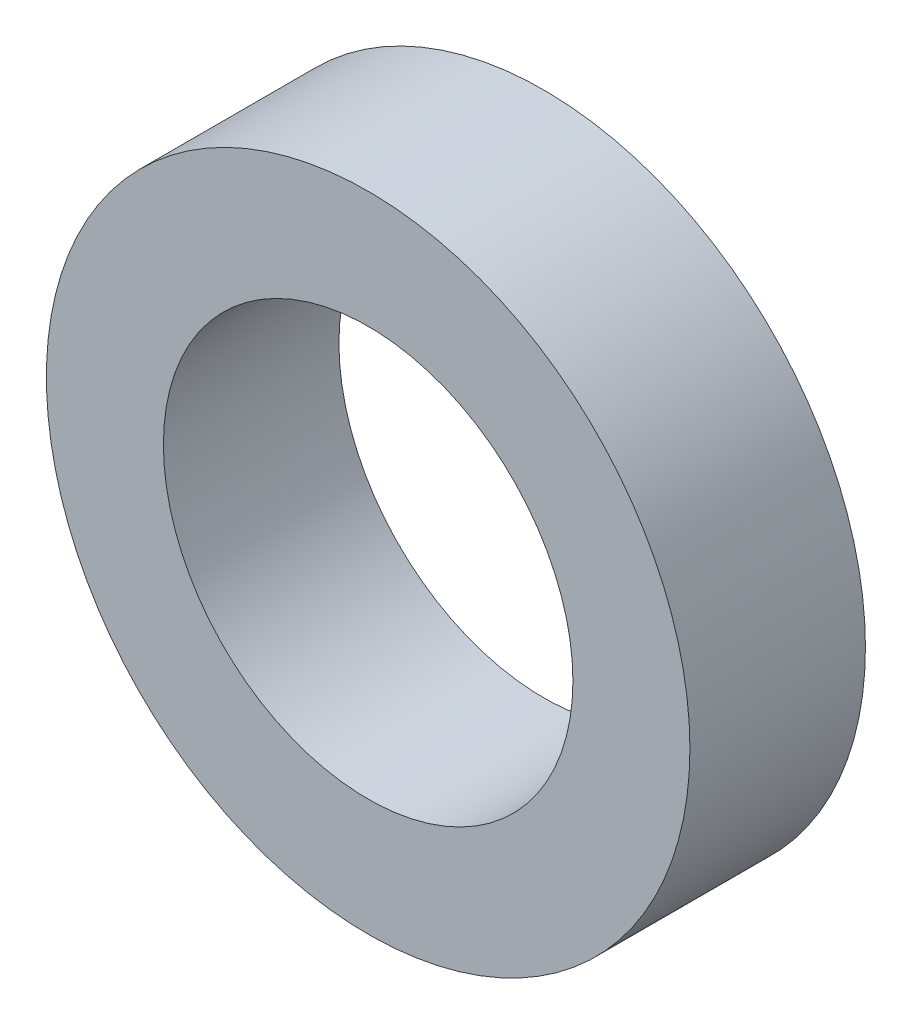
ISO-10303-21;
HEADER;
FILE_DESCRIPTION(('STEP AP214'),'2;1');
FILE_NAME('part.step','',(''),(''),'','','');
FILE_SCHEMA(('AUTOMOTIVE_DESIGN { 1 0 10303 214 1 1 1 1 }'));
ENDSEC;
DATA;
#1=APPLICATION_CONTEXT('core data for automotive mechanical design processes');
#2=APPLICATION_PROTOCOL_DEFINITION('international standard','automotive_design',2000,#1);
#3=PRODUCT_CONTEXT('',#1,'mechanical');
#4=PRODUCT('Part','Part','',(#3));
#5=PRODUCT_RELATED_PRODUCT_CATEGORY('part','',(#4));
#6=PRODUCT_DEFINITION_FORMATION('','',#4);
#7=PRODUCT_DEFINITION_CONTEXT('part definition',#1,'design');
#8=PRODUCT_DEFINITION('design','',#6,#7);
#9=PRODUCT_DEFINITION_SHAPE('','',#8);
#10=(LENGTH_UNIT() NAMED_UNIT(*) SI_UNIT(.MILLI.,.METRE.));
#11=(NAMED_UNIT(*) PLANE_ANGLE_UNIT() SI_UNIT($,.RADIAN.));
#12=(NAMED_UNIT(*) SI_UNIT($,.STERADIAN.) SOLID_ANGLE_UNIT());
#13=UNCERTAINTY_MEASURE_WITH_UNIT(LENGTH_MEASURE(1.E-05),#10,'distance_accuracy_value','');
#14=(GEOMETRIC_REPRESENTATION_CONTEXT(3) GLOBAL_UNCERTAINTY_ASSIGNED_CONTEXT((#13)) GLOBAL_UNIT_ASSIGNED_CONTEXT((#10,
#11,#12)) REPRESENTATION_CONTEXT('',''));
#15=CARTESIAN_POINT('',(0.,0.,0.));
#16=DIRECTION('',(0.,0.,1.));
#17=DIRECTION('',(1.,0.,0.));
#18=AXIS2_PLACEMENT_3D('',#15,#16,#17);
#19=CARTESIAN_POINT('',(0.,0.,3.));
#20=DIRECTION('',(0.,0.,1.));
#21=DIRECTION('',(1.,0.,0.));
#22=AXIS2_PLACEMENT_3D('',#19,#20,#21);
#23=PLANE('',#22);
#24=CARTESIAN_POINT('',(0.,0.,3.));
#25=DIRECTION('',(0.,0.,1.));
#26=DIRECTION('',(1.,0.,0.));
#27=AXIS2_PLACEMENT_3D('',#24,#25,#26);
#28=CIRCLE('',#27,5.5);
#29=CARTESIAN_POINT('',(5.5,0.,3.));
#30=VERTEX_POINT('',#29);
#31=EDGE_CURVE('E10',#30,#30,#28,.T.);
#32=ORIENTED_EDGE('',*,*,#31,.T.);
#33=EDGE_LOOP('',(#32));
#34=FACE_BOUND('',#33,.T.);
#35=CARTESIAN_POINT('',(0.,0.,3.));
#36=DIRECTION('',(0.,0.,1.));
#37=DIRECTION('',(1.,0.,0.));
#38=AXIS2_PLACEMENT_3D('',#35,#36,#37);
#39=CIRCLE('',#38,3.5);
#40=CARTESIAN_POINT('',(3.5,0.,3.));
#41=VERTEX_POINT('',#40);
#42=EDGE_CURVE('E44',#41,#41,#39,.T.);
#43=ORIENTED_EDGE('',*,*,#42,.F.);
#44=EDGE_LOOP('',(#43));
#45=FACE_BOUND('',#44,.T.);
#46=ADVANCED_FACE('F33',(#34,#45),#23,.T.);
#47=CARTESIAN_POINT('',(0.,0.,0.));
#48=DIRECTION('',(0.,0.,1.));
#49=DIRECTION('',(1.,0.,0.));
#50=AXIS2_PLACEMENT_3D('',#47,#48,#49);
#51=PLANE('',#50);
#52=CARTESIAN_POINT('',(0.,0.,0.));
#53=DIRECTION('',(0.,0.,1.));
#54=DIRECTION('',(1.,0.,0.));
#55=AXIS2_PLACEMENT_3D('',#52,#53,#54);
#56=CIRCLE('',#55,5.5);
#57=CARTESIAN_POINT('',(5.5,0.,0.));
#58=VERTEX_POINT('',#57);
#59=EDGE_CURVE('E37',#58,#58,#56,.T.);
#60=ORIENTED_EDGE('',*,*,#59,.F.);
#61=EDGE_LOOP('',(#60));
#62=FACE_BOUND('',#61,.T.);
#63=CARTESIAN_POINT('',(0.,0.,0.));
#64=DIRECTION('',(0.,0.,1.));
#65=DIRECTION('',(1.,0.,0.));
#66=AXIS2_PLACEMENT_3D('',#63,#64,#65);
#67=CIRCLE('',#66,3.5);
#68=CARTESIAN_POINT('',(3.5,0.,0.));
#69=VERTEX_POINT('',#68);
#70=EDGE_CURVE('E46',#69,#69,#67,.T.);
#71=ORIENTED_EDGE('',*,*,#70,.T.);
#72=EDGE_LOOP('',(#71));
#73=FACE_BOUND('',#72,.T.);
#74=ADVANCED_FACE('F56',(#62,#73),#51,.F.);
#75=CARTESIAN_POINT('',(0.,0.,3.));
#76=DIRECTION('',(0.,0.,-1.));
#77=DIRECTION('',(-1.,0.,0.));
#78=AXIS2_PLACEMENT_3D('',#75,#76,#77);
#79=CYLINDRICAL_SURFACE('',#78,5.5);
#80=ORIENTED_EDGE('',*,*,#31,.F.);
#81=EDGE_LOOP('',(#80));
#82=FACE_BOUND('',#81,.T.);
#83=ORIENTED_EDGE('',*,*,#59,.T.);
#84=EDGE_LOOP('',(#83));
#85=FACE_BOUND('',#84,.T.);
#86=ADVANCED_FACE('F35',(#82,#85),#79,.T.);
#87=CARTESIAN_POINT('',(0.,0.,3.));
#88=DIRECTION('',(0.,0.,-1.));
#89=DIRECTION('',(-1.,0.,0.));
#90=AXIS2_PLACEMENT_3D('',#87,#88,#89);
#91=CYLINDRICAL_SURFACE('',#90,3.5);
#92=ORIENTED_EDGE('',*,*,#42,.T.);
#93=EDGE_LOOP('',(#92));
#94=FACE_BOUND('',#93,.T.);
#95=ORIENTED_EDGE('',*,*,#70,.F.);
#96=EDGE_LOOP('',(#95));
#97=FACE_BOUND('',#96,.T.);
#98=ADVANCED_FACE('F52',(#94,#97),#91,.F.);
#99=CLOSED_SHELL('',(#46,#74,#86,#98));
#100=MANIFOLD_SOLID_BREP('B2',#99);
#101=ADVANCED_BREP_SHAPE_REPRESENTATION('',(#18,#100),#14);
#102=SHAPE_DEFINITION_REPRESENTATION(#9,#101);
ENDSEC;
END-ISO-10303-21;
